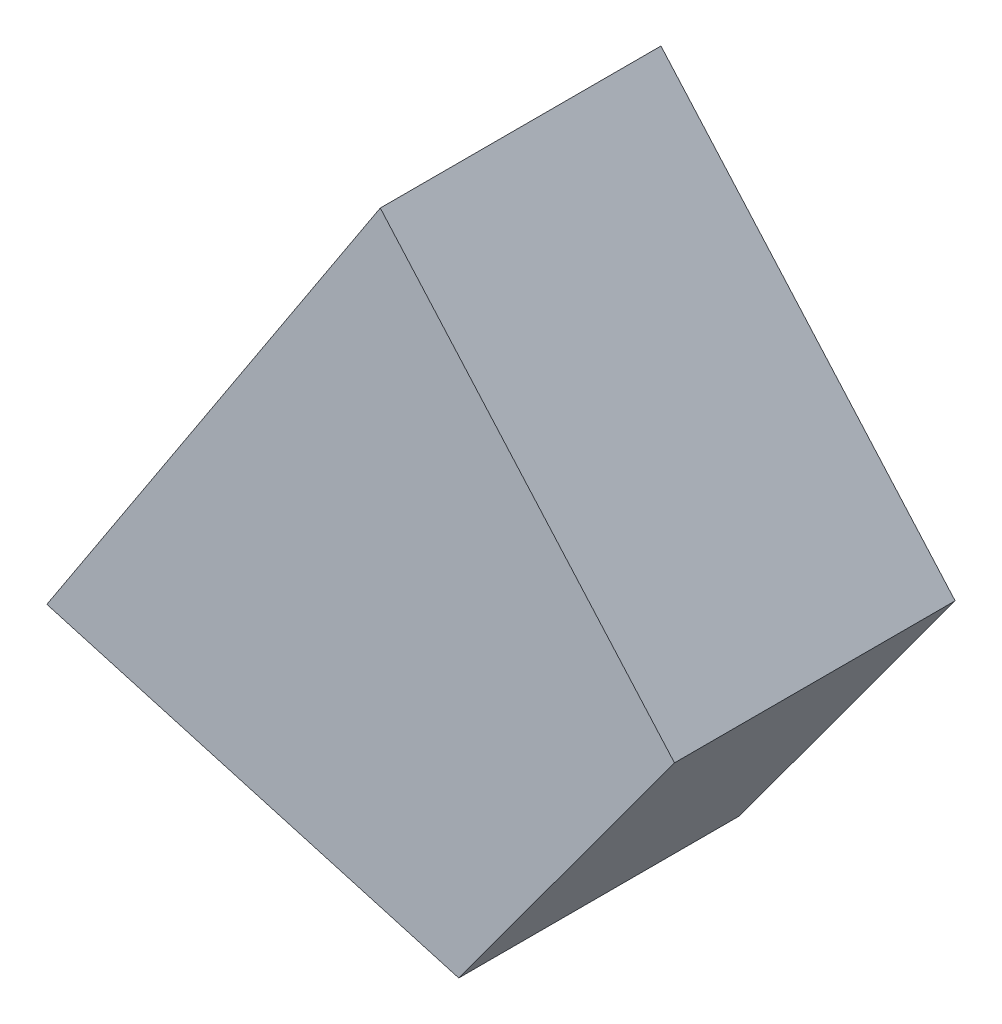
ISO-10303-21;
HEADER;
FILE_DESCRIPTION(('STEP AP214'),'2;1');
FILE_NAME('part.step','',(''),(''),'','','');
FILE_SCHEMA(('AUTOMOTIVE_DESIGN { 1 0 10303 214 1 1 1 1 }'));
ENDSEC;
DATA;
#1=APPLICATION_CONTEXT('core data for automotive mechanical design processes');
#2=APPLICATION_PROTOCOL_DEFINITION('international standard','automotive_design',2000,#1);
#3=PRODUCT_CONTEXT('',#1,'mechanical');
#4=PRODUCT('Part','Part','',(#3));
#5=PRODUCT_RELATED_PRODUCT_CATEGORY('part','',(#4));
#6=PRODUCT_DEFINITION_FORMATION('','',#4);
#7=PRODUCT_DEFINITION_CONTEXT('part definition',#1,'design');
#8=PRODUCT_DEFINITION('design','',#6,#7);
#9=PRODUCT_DEFINITION_SHAPE('','',#8);
#10=(LENGTH_UNIT() NAMED_UNIT(*) SI_UNIT(.MILLI.,.METRE.));
#11=(NAMED_UNIT(*) PLANE_ANGLE_UNIT() SI_UNIT($,.RADIAN.));
#12=(NAMED_UNIT(*) SI_UNIT($,.STERADIAN.) SOLID_ANGLE_UNIT());
#13=UNCERTAINTY_MEASURE_WITH_UNIT(LENGTH_MEASURE(1.E-05),#10,'distance_accuracy_value','');
#14=(GEOMETRIC_REPRESENTATION_CONTEXT(3) GLOBAL_UNCERTAINTY_ASSIGNED_CONTEXT((#13)) GLOBAL_UNIT_ASSIGNED_CONTEXT((#10,
#11,#12)) REPRESENTATION_CONTEXT('',''));
#15=CARTESIAN_POINT('',(0.,0.,0.));
#16=DIRECTION('',(0.,0.,1.));
#17=DIRECTION('',(1.,0.,0.));
#18=AXIS2_PLACEMENT_3D('',#15,#16,#17);
#19=CARTESIAN_POINT('',(-13.,-3.,0.));
#20=DIRECTION('',(0.,0.,-1.));
#21=DIRECTION('',(1.,0.,0.));
#22=AXIS2_PLACEMENT_3D('',#19,#20,#21);
#23=PLANE('',#22);
#24=DIRECTION('',(-0.547249362982703,-0.836969613973546,0.));
#25=VECTOR('',#24,1.);
#26=CARTESIAN_POINT('',(4.,23.,0.));
#27=LINE('',#26,#25);
#28=CARTESIAN_POINT('',(4.,23.,0.));
#29=VERTEX_POINT('',#28);
#30=CARTESIAN_POINT('',(-13.,-3.,0.));
#31=VERTEX_POINT('',#30);
#32=EDGE_CURVE('E46',#29,#31,#27,.T.);
#33=ORIENTED_EDGE('',*,*,#32,.F.);
#34=DIRECTION('',(-0.661621637086846,0.749837855365093,0.));
#35=VECTOR('',#34,1.);
#36=CARTESIAN_POINT('',(19.,6.,0.));
#37=LINE('',#36,#35);
#38=CARTESIAN_POINT('',(19.,6.,0.));
#39=VERTEX_POINT('',#38);
#40=EDGE_CURVE('E45',#39,#29,#37,.T.);
#41=ORIENTED_EDGE('',*,*,#40,.F.);
#42=DIRECTION('',(0.591363663627517,0.806404995855705,0.));
#43=VECTOR('',#42,1.);
#44=CARTESIAN_POINT('',(8.,-9.,0.));
#45=LINE('',#44,#43);
#46=CARTESIAN_POINT('',(8.,-9.,0.));
#47=VERTEX_POINT('',#46);
#48=EDGE_CURVE('E44',#47,#39,#45,.T.);
#49=ORIENTED_EDGE('',*,*,#48,.F.);
#50=DIRECTION('',(0.961523947640823,-0.274721127897378,0.));
#51=VECTOR('',#50,1.);
#52=CARTESIAN_POINT('',(-13.,-3.,0.));
#53=LINE('',#52,#51);
#54=EDGE_CURVE('E43',#31,#47,#53,.T.);
#55=ORIENTED_EDGE('',*,*,#54,.F.);
#56=EDGE_LOOP('',(#33,#41,#49,#55));
#57=FACE_BOUND('',#56,.T.);
#58=ADVANCED_FACE('F7',(#57),#23,.T.);
#59=CARTESIAN_POINT('',(-13.,-3.,14.31));
#60=DIRECTION('',(0.,0.,1.));
#61=DIRECTION('',(1.,0.,0.));
#62=AXIS2_PLACEMENT_3D('',#59,#60,#61);
#63=PLANE('',#62);
#64=DIRECTION('',(0.961523947640823,-0.274721127897378,0.));
#65=VECTOR('',#64,1.);
#66=CARTESIAN_POINT('',(-13.,-3.,14.31));
#67=LINE('',#66,#65);
#68=CARTESIAN_POINT('',(-13.,-3.,14.31));
#69=VERTEX_POINT('',#68);
#70=CARTESIAN_POINT('',(8.,-9.,14.31));
#71=VERTEX_POINT('',#70);
#72=EDGE_CURVE('E47',#69,#71,#67,.T.);
#73=ORIENTED_EDGE('',*,*,#72,.T.);
#74=DIRECTION('',(0.591363663627517,0.806404995855705,0.));
#75=VECTOR('',#74,1.);
#76=CARTESIAN_POINT('',(8.,-9.,14.31));
#77=LINE('',#76,#75);
#78=CARTESIAN_POINT('',(19.,6.,14.31));
#79=VERTEX_POINT('',#78);
#80=EDGE_CURVE('E48',#71,#79,#77,.T.);
#81=ORIENTED_EDGE('',*,*,#80,.T.);
#82=DIRECTION('',(-0.661621637086846,0.749837855365093,0.));
#83=VECTOR('',#82,1.);
#84=CARTESIAN_POINT('',(19.,6.,14.31));
#85=LINE('',#84,#83);
#86=CARTESIAN_POINT('',(4.,23.,14.31));
#87=VERTEX_POINT('',#86);
#88=EDGE_CURVE('E49',#79,#87,#85,.T.);
#89=ORIENTED_EDGE('',*,*,#88,.T.);
#90=DIRECTION('',(-0.547249362982703,-0.836969613973546,0.));
#91=VECTOR('',#90,1.);
#92=CARTESIAN_POINT('',(4.,23.,14.31));
#93=LINE('',#92,#91);
#94=EDGE_CURVE('E50',#87,#69,#93,.T.);
#95=ORIENTED_EDGE('',*,*,#94,.T.);
#96=EDGE_LOOP('',(#73,#81,#89,#95));
#97=FACE_BOUND('',#96,.T.);
#98=ADVANCED_FACE('F13',(#97),#63,.T.);
#99=CARTESIAN_POINT('',(-13.,-3.,0.));
#100=DIRECTION('',(-0.274721127897378,-0.961523947640823,0.));
#101=DIRECTION('',(0.961523947640823,-0.274721127897378,0.));
#102=AXIS2_PLACEMENT_3D('',#99,#100,#101);
#103=PLANE('',#102);
#104=ORIENTED_EDGE('',*,*,#54,.T.);
#105=DIRECTION('',(0.,0.,1.));
#106=VECTOR('',#105,1.);
#107=CARTESIAN_POINT('',(8.,-9.,0.));
#108=LINE('',#107,#106);
#109=EDGE_CURVE('E52',#47,#71,#108,.T.);
#110=ORIENTED_EDGE('',*,*,#109,.T.);
#111=ORIENTED_EDGE('',*,*,#72,.F.);
#112=DIRECTION('',(0.,0.,1.));
#113=VECTOR('',#112,1.);
#114=CARTESIAN_POINT('',(-13.,-3.,0.));
#115=LINE('',#114,#113);
#116=EDGE_CURVE('E51',#31,#69,#115,.T.);
#117=ORIENTED_EDGE('',*,*,#116,.F.);
#118=EDGE_LOOP('',(#104,#110,#111,#117));
#119=FACE_BOUND('',#118,.T.);
#120=ADVANCED_FACE('F19',(#119),#103,.T.);
#121=CARTESIAN_POINT('',(8.,-9.,0.));
#122=DIRECTION('',(0.806404995855706,-0.591363663627517,0.));
#123=DIRECTION('',(0.591363663627517,0.806404995855705,0.));
#124=AXIS2_PLACEMENT_3D('',#121,#122,#123);
#125=PLANE('',#124);
#126=ORIENTED_EDGE('',*,*,#48,.T.);
#127=DIRECTION('',(0.,0.,1.));
#128=VECTOR('',#127,1.);
#129=CARTESIAN_POINT('',(19.,6.,0.));
#130=LINE('',#129,#128);
#131=EDGE_CURVE('E53',#39,#79,#130,.T.);
#132=ORIENTED_EDGE('',*,*,#131,.T.);
#133=ORIENTED_EDGE('',*,*,#80,.F.);
#134=ORIENTED_EDGE('',*,*,#109,.F.);
#135=EDGE_LOOP('',(#126,#132,#133,#134));
#136=FACE_BOUND('',#135,.T.);
#137=ADVANCED_FACE('F25',(#136),#125,.T.);
#138=CARTESIAN_POINT('',(19.,6.,0.));
#139=DIRECTION('',(0.749837855365093,0.661621637086846,0.));
#140=DIRECTION('',(-0.661621637086846,0.749837855365093,0.));
#141=AXIS2_PLACEMENT_3D('',#138,#139,#140);
#142=PLANE('',#141);
#143=ORIENTED_EDGE('',*,*,#40,.T.);
#144=DIRECTION('',(0.,0.,1.));
#145=VECTOR('',#144,1.);
#146=CARTESIAN_POINT('',(4.,23.,0.));
#147=LINE('',#146,#145);
#148=EDGE_CURVE('E54',#29,#87,#147,.T.);
#149=ORIENTED_EDGE('',*,*,#148,.T.);
#150=ORIENTED_EDGE('',*,*,#88,.F.);
#151=ORIENTED_EDGE('',*,*,#131,.F.);
#152=EDGE_LOOP('',(#143,#149,#150,#151));
#153=FACE_BOUND('',#152,.T.);
#154=ADVANCED_FACE('F31',(#153),#142,.T.);
#155=CARTESIAN_POINT('',(4.,23.,0.));
#156=DIRECTION('',(-0.836969613973546,0.547249362982703,0.));
#157=DIRECTION('',(-0.547249362982703,-0.836969613973546,0.));
#158=AXIS2_PLACEMENT_3D('',#155,#156,#157);
#159=PLANE('',#158);
#160=ORIENTED_EDGE('',*,*,#32,.T.);
#161=ORIENTED_EDGE('',*,*,#116,.T.);
#162=ORIENTED_EDGE('',*,*,#94,.F.);
#163=ORIENTED_EDGE('',*,*,#148,.F.);
#164=EDGE_LOOP('',(#160,#161,#162,#163));
#165=FACE_BOUND('',#164,.T.);
#166=ADVANCED_FACE('F37',(#165),#159,.T.);
#167=CLOSED_SHELL('',(#58,#98,#120,#137,#154,#166));
#168=MANIFOLD_SOLID_BREP('B2',#167);
#169=ADVANCED_BREP_SHAPE_REPRESENTATION('',(#18,#168),#14);
#170=SHAPE_DEFINITION_REPRESENTATION(#9,#169);
ENDSEC;
END-ISO-10303-21;
